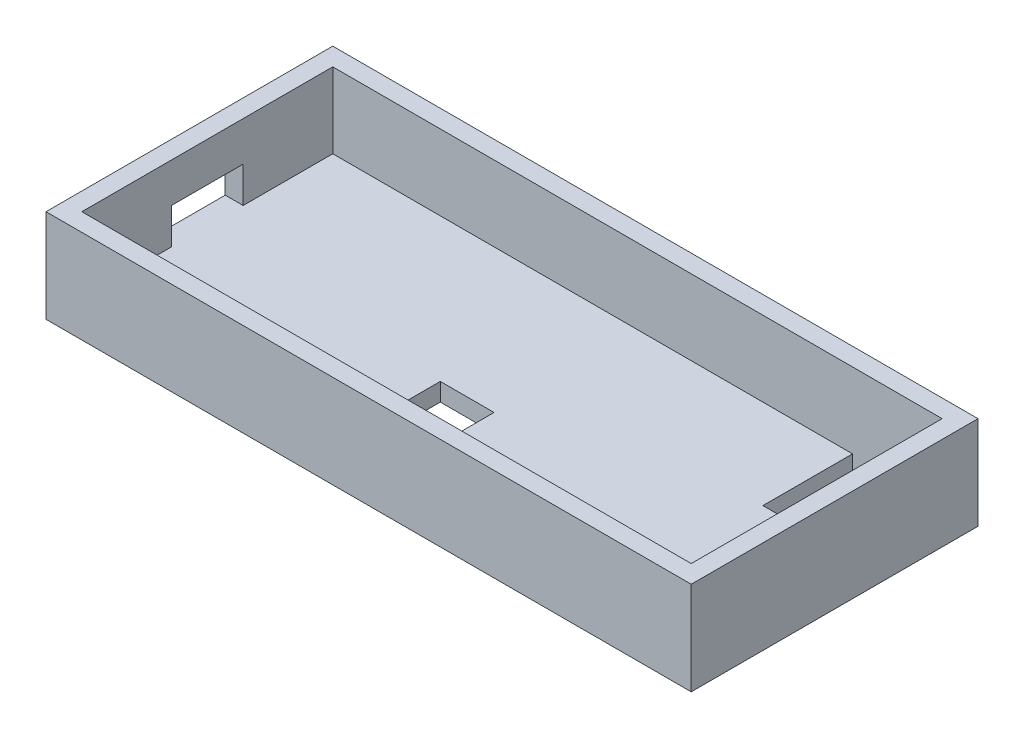
ISO-10303-21;
HEADER;
FILE_DESCRIPTION(('STEP AP214'),'2;1');
FILE_NAME('part.step','',(''),(''),'','','');
FILE_SCHEMA(('AUTOMOTIVE_DESIGN { 1 0 10303 214 1 1 1 1 }'));
ENDSEC;
DATA;
#1=APPLICATION_CONTEXT('core data for automotive mechanical design processes');
#2=APPLICATION_PROTOCOL_DEFINITION('international standard','automotive_design',2000,#1);
#3=PRODUCT_CONTEXT('',#1,'mechanical');
#4=PRODUCT('Part','Part','',(#3));
#5=PRODUCT_RELATED_PRODUCT_CATEGORY('part','',(#4));
#6=PRODUCT_DEFINITION_FORMATION('','',#4);
#7=PRODUCT_DEFINITION_CONTEXT('part definition',#1,'design');
#8=PRODUCT_DEFINITION('design','',#6,#7);
#9=PRODUCT_DEFINITION_SHAPE('','',#8);
#10=(LENGTH_UNIT() NAMED_UNIT(*) SI_UNIT(.MILLI.,.METRE.));
#11=(NAMED_UNIT(*) PLANE_ANGLE_UNIT() SI_UNIT($,.RADIAN.));
#12=(NAMED_UNIT(*) SI_UNIT($,.STERADIAN.) SOLID_ANGLE_UNIT());
#13=UNCERTAINTY_MEASURE_WITH_UNIT(LENGTH_MEASURE(1.E-05),#10,'distance_accuracy_value','');
#14=(GEOMETRIC_REPRESENTATION_CONTEXT(3) GLOBAL_UNCERTAINTY_ASSIGNED_CONTEXT((#13)) GLOBAL_UNIT_ASSIGNED_CONTEXT((#10,
#11,#12)) REPRESENTATION_CONTEXT('',''));
#15=CARTESIAN_POINT('',(0.,0.,0.));
#16=DIRECTION('',(0.,0.,1.));
#17=DIRECTION('',(1.,0.,0.));
#18=AXIS2_PLACEMENT_3D('',#15,#16,#17);
#19=CARTESIAN_POINT('',(-90.0000000000002,26.,0.));
#20=DIRECTION('',(1.,0.,0.));
#21=DIRECTION('',(0.,0.,-1.));
#22=AXIS2_PLACEMENT_3D('',#19,#20,#21);
#23=PLANE('',#22);
#24=DIRECTION('',(0.,0.,1.));
#25=VECTOR('',#24,1.);
#26=CARTESIAN_POINT('',(-90.0000000000002,0.,0.));
#27=LINE('',#26,#25);
#28=CARTESIAN_POINT('',(-90.0000000000002,0.,-40.0000000000001));
#29=VERTEX_POINT('',#28);
#30=CARTESIAN_POINT('',(-90.0000000000002,0.,39.9999999999999));
#31=VERTEX_POINT('',#30);
#32=EDGE_CURVE('E325',#29,#31,#27,.T.);
#33=ORIENTED_EDGE('',*,*,#32,.T.);
#34=DIRECTION('',(0.,-1.,0.));
#35=VECTOR('',#34,1.);
#36=CARTESIAN_POINT('',(-90.0000000000002,26.,39.9999999999999));
#37=LINE('',#36,#35);
#38=CARTESIAN_POINT('',(-90.0000000000002,26.,39.9999999999999));
#39=VERTEX_POINT('',#38);
#40=EDGE_CURVE('E350',#39,#31,#37,.T.);
#41=ORIENTED_EDGE('',*,*,#40,.F.);
#42=DIRECTION('',(0.,0.,1.));
#43=VECTOR('',#42,1.);
#44=CARTESIAN_POINT('',(-90.0000000000002,26.,0.));
#45=LINE('',#44,#43);
#46=CARTESIAN_POINT('',(-90.0000000000002,26.,-40.0000000000001));
#47=VERTEX_POINT('',#46);
#48=EDGE_CURVE('E296',#47,#39,#45,.T.);
#49=ORIENTED_EDGE('',*,*,#48,.F.);
#50=DIRECTION('',(0.,-1.,0.));
#51=VECTOR('',#50,1.);
#52=CARTESIAN_POINT('',(-90.0000000000002,26.,-40.0000000000001));
#53=LINE('',#52,#51);
#54=EDGE_CURVE('E353',#47,#29,#53,.T.);
#55=ORIENTED_EDGE('',*,*,#54,.T.);
#56=EDGE_LOOP('',(#33,#41,#49,#55));
#57=FACE_BOUND('',#56,.T.);
#58=DIRECTION('',(0.,-1.,0.));
#59=VECTOR('',#58,1.);
#60=CARTESIAN_POINT('',(-90.0000000000002,0.,10.));
#61=LINE('',#60,#59);
#62=CARTESIAN_POINT('',(-90.0000000000002,15.,10.));
#63=VERTEX_POINT('',#62);
#64=CARTESIAN_POINT('',(-90.0000000000002,5.,10.));
#65=VERTEX_POINT('',#64);
#66=EDGE_CURVE('E436',#63,#65,#61,.T.);
#67=ORIENTED_EDGE('',*,*,#66,.T.);
#68=DIRECTION('',(0.,0.,1.));
#69=VECTOR('',#68,1.);
#70=CARTESIAN_POINT('',(-90.0000000000002,5.,0.));
#71=LINE('',#70,#69);
#72=CARTESIAN_POINT('',(-90.0000000000002,5.,-9.99999999999998));
#73=VERTEX_POINT('',#72);
#74=EDGE_CURVE('E440',#73,#65,#71,.T.);
#75=ORIENTED_EDGE('',*,*,#74,.F.);
#76=DIRECTION('',(0.,-1.,0.));
#77=VECTOR('',#76,1.);
#78=CARTESIAN_POINT('',(-90.0000000000002,0.,-9.99999999999998));
#79=LINE('',#78,#77);
#80=CARTESIAN_POINT('',(-90.0000000000002,15.,-9.99999999999998));
#81=VERTEX_POINT('',#80);
#82=EDGE_CURVE('E83',#81,#73,#79,.T.);
#83=ORIENTED_EDGE('',*,*,#82,.F.);
#84=DIRECTION('',(0.,0.,1.));
#85=VECTOR('',#84,1.);
#86=CARTESIAN_POINT('',(-90.0000000000002,15.,0.));
#87=LINE('',#86,#85);
#88=EDGE_CURVE('E216',#81,#63,#87,.T.);
#89=ORIENTED_EDGE('',*,*,#88,.T.);
#90=EDGE_LOOP('',(#67,#75,#83,#89));
#91=FACE_BOUND('',#90,.T.);
#92=ADVANCED_FACE('F65',(#57,#91),#23,.F.);
#93=CARTESIAN_POINT('',(-85.0000000000002,26.,0.));
#94=DIRECTION('',(1.,0.,0.));
#95=DIRECTION('',(0.,0.,-1.));
#96=AXIS2_PLACEMENT_3D('',#93,#94,#95);
#97=PLANE('',#96);
#98=DIRECTION('',(0.,0.,1.));
#99=VECTOR('',#98,1.);
#100=CARTESIAN_POINT('',(-85.0000000000002,5.,0.));
#101=LINE('',#100,#99);
#102=CARTESIAN_POINT('',(-85.0000000000002,5.,10.));
#103=VERTEX_POINT('',#102);
#104=CARTESIAN_POINT('',(-85.0000000000002,5.,34.9999999999998));
#105=VERTEX_POINT('',#104);
#106=EDGE_CURVE('E225',#103,#105,#101,.T.);
#107=ORIENTED_EDGE('',*,*,#106,.F.);
#108=DIRECTION('',(0.,-1.,0.));
#109=VECTOR('',#108,1.);
#110=CARTESIAN_POINT('',(-85.0000000000002,0.,10.));
#111=LINE('',#110,#109);
#112=CARTESIAN_POINT('',(-85.0000000000002,15.,10.));
#113=VERTEX_POINT('',#112);
#114=EDGE_CURVE('E215',#113,#103,#111,.T.);
#115=ORIENTED_EDGE('',*,*,#114,.F.);
#116=DIRECTION('',(0.,0.,1.));
#117=VECTOR('',#116,1.);
#118=CARTESIAN_POINT('',(-85.0000000000002,15.,0.));
#119=LINE('',#118,#117);
#120=CARTESIAN_POINT('',(-85.0000000000002,15.,-9.99999999999998));
#121=VERTEX_POINT('',#120);
#122=EDGE_CURVE('E205',#121,#113,#119,.T.);
#123=ORIENTED_EDGE('',*,*,#122,.F.);
#124=DIRECTION('',(0.,-1.,0.));
#125=VECTOR('',#124,1.);
#126=CARTESIAN_POINT('',(-85.0000000000002,0.,-9.99999999999998));
#127=LINE('',#126,#125);
#128=CARTESIAN_POINT('',(-85.0000000000002,5.,-9.99999999999998));
#129=VERTEX_POINT('',#128);
#130=EDGE_CURVE('E200',#121,#129,#127,.T.);
#131=ORIENTED_EDGE('',*,*,#130,.T.);
#132=CARTESIAN_POINT('',(-85.0000000000002,5.,-35.0000000000002));
#133=VERTEX_POINT('',#132);
#134=EDGE_CURVE('E211',#133,#129,#101,.T.);
#135=ORIENTED_EDGE('',*,*,#134,.F.);
#136=DIRECTION('',(0.,-1.,0.));
#137=VECTOR('',#136,1.);
#138=CARTESIAN_POINT('',(-85.0000000000002,26.,-35.0000000000002));
#139=LINE('',#138,#137);
#140=CARTESIAN_POINT('',(-85.0000000000002,26.,-35.0000000000002));
#141=VERTEX_POINT('',#140);
#142=EDGE_CURVE('E338',#141,#133,#139,.T.);
#143=ORIENTED_EDGE('',*,*,#142,.F.);
#144=DIRECTION('',(0.,0.,1.));
#145=VECTOR('',#144,1.);
#146=CARTESIAN_POINT('',(-85.0000000000002,26.,0.));
#147=LINE('',#146,#145);
#148=CARTESIAN_POINT('',(-85.0000000000002,26.,34.9999999999998));
#149=VERTEX_POINT('',#148);
#150=EDGE_CURVE('E313',#141,#149,#147,.T.);
#151=ORIENTED_EDGE('',*,*,#150,.T.);
#152=DIRECTION('',(0.,-1.,0.));
#153=VECTOR('',#152,1.);
#154=CARTESIAN_POINT('',(-85.0000000000002,26.,34.9999999999998));
#155=LINE('',#154,#153);
#156=EDGE_CURVE('E341',#149,#105,#155,.T.);
#157=ORIENTED_EDGE('',*,*,#156,.T.);
#158=EDGE_LOOP('',(#107,#115,#123,#131,#135,#143,#151,#157));
#159=FACE_BOUND('',#158,.T.);
#160=ADVANCED_FACE('F210',(#159),#97,.T.);
#161=CARTESIAN_POINT('',(84.9999999999998,26.,0.));
#162=DIRECTION('',(1.,0.,0.));
#163=DIRECTION('',(0.,0.,-1.));
#164=AXIS2_PLACEMENT_3D('',#161,#162,#163);
#165=PLANE('',#164);
#166=DIRECTION('',(0.,-1.,0.));
#167=VECTOR('',#166,1.);
#168=CARTESIAN_POINT('',(84.9999999999998,5.,-10.0000000000002));
#169=LINE('',#168,#167);
#170=CARTESIAN_POINT('',(84.9999999999998,5.,-10.0000000000002));
#171=VERTEX_POINT('',#170);
#172=CARTESIAN_POINT('',(84.9999999999998,0.,-10.0000000000002));
#173=VERTEX_POINT('',#172);
#174=EDGE_CURVE('E272',#171,#173,#169,.T.);
#175=ORIENTED_EDGE('',*,*,#174,.F.);
#176=DIRECTION('',(0.,0.,1.));
#177=VECTOR('',#176,1.);
#178=CARTESIAN_POINT('',(84.9999999999998,5.,0.));
#179=LINE('',#178,#177);
#180=CARTESIAN_POINT('',(84.9999999999998,5.,34.9999999999999));
#181=VERTEX_POINT('',#180);
#182=EDGE_CURVE('E395',#171,#181,#179,.T.);
#183=ORIENTED_EDGE('',*,*,#182,.T.);
#184=DIRECTION('',(0.,-1.,0.));
#185=VECTOR('',#184,1.);
#186=CARTESIAN_POINT('',(84.9999999999998,26.,34.9999999999999));
#187=LINE('',#186,#185);
#188=CARTESIAN_POINT('',(84.9999999999998,26.,34.9999999999999));
#189=VERTEX_POINT('',#188);
#190=EDGE_CURVE('E75',#189,#181,#187,.T.);
#191=ORIENTED_EDGE('',*,*,#190,.F.);
#192=DIRECTION('',(0.,0.,1.));
#193=VECTOR('',#192,1.);
#194=CARTESIAN_POINT('',(84.9999999999998,26.,0.));
#195=LINE('',#194,#193);
#196=CARTESIAN_POINT('',(84.9999999999998,26.,-35.0000000000002));
#197=VERTEX_POINT('',#196);
#198=EDGE_CURVE('E306',#197,#189,#195,.T.);
#199=ORIENTED_EDGE('',*,*,#198,.F.);
#200=DIRECTION('',(0.,-1.,0.));
#201=VECTOR('',#200,1.);
#202=CARTESIAN_POINT('',(84.9999999999998,26.,-35.0000000000002));
#203=LINE('',#202,#201);
#204=CARTESIAN_POINT('',(84.9999999999998,0.,-35.0000000000002));
#205=VERTEX_POINT('',#204);
#206=EDGE_CURVE('E12',#197,#205,#203,.T.);
#207=ORIENTED_EDGE('',*,*,#206,.T.);
#208=DIRECTION('',(0.,0.,1.));
#209=VECTOR('',#208,1.);
#210=CARTESIAN_POINT('',(84.9999999999998,0.,0.));
#211=LINE('',#210,#209);
#212=EDGE_CURVE('E292',#205,#173,#211,.T.);
#213=ORIENTED_EDGE('',*,*,#212,.T.);
#214=EDGE_LOOP('',(#175,#183,#191,#199,#207,#213));
#215=FACE_BOUND('',#214,.T.);
#216=ADVANCED_FACE('F392',(#215),#165,.F.);
#217=CARTESIAN_POINT('',(0.,26.,-35.0000000000002));
#218=DIRECTION('',(0.,0.,-1.));
#219=DIRECTION('',(-1.,0.,0.));
#220=AXIS2_PLACEMENT_3D('',#217,#218,#219);
#221=PLANE('',#220);
#222=DIRECTION('',(1.,0.,0.));
#223=VECTOR('',#222,1.);
#224=CARTESIAN_POINT('',(0.,5.,-35.0000000000002));
#225=LINE('',#224,#223);
#226=CARTESIAN_POINT('',(59.9999999999998,5.,-35.0000000000002));
#227=VERTEX_POINT('',#226);
#228=EDGE_CURVE('E222',#133,#227,#225,.T.);
#229=ORIENTED_EDGE('',*,*,#228,.T.);
#230=DIRECTION('',(0.,-1.,0.));
#231=VECTOR('',#230,1.);
#232=CARTESIAN_POINT('',(59.9999999999998,5.,-35.0000000000002));
#233=LINE('',#232,#231);
#234=CARTESIAN_POINT('',(59.9999999999998,0.,-35.0000000000002));
#235=VERTEX_POINT('',#234);
#236=EDGE_CURVE('E264',#227,#235,#233,.T.);
#237=ORIENTED_EDGE('',*,*,#236,.T.);
#238=DIRECTION('',(1.,0.,0.));
#239=VECTOR('',#238,1.);
#240=CARTESIAN_POINT('',(0.,0.,-35.0000000000002));
#241=LINE('',#240,#239);
#242=EDGE_CURVE('E332',#235,#205,#241,.T.);
#243=ORIENTED_EDGE('',*,*,#242,.T.);
#244=ORIENTED_EDGE('',*,*,#206,.F.);
#245=DIRECTION('',(1.,0.,0.));
#246=VECTOR('',#245,1.);
#247=CARTESIAN_POINT('',(0.,26.,-35.0000000000002));
#248=LINE('',#247,#246);
#249=EDGE_CURVE('E302',#141,#197,#248,.T.);
#250=ORIENTED_EDGE('',*,*,#249,.F.);
#251=ORIENTED_EDGE('',*,*,#142,.T.);
#252=EDGE_LOOP('',(#229,#237,#243,#244,#250,#251));
#253=FACE_BOUND('',#252,.T.);
#254=ADVANCED_FACE('F387',(#253),#221,.F.);
#255=CARTESIAN_POINT('',(0.,26.,34.9999999999999));
#256=DIRECTION('',(0.,0.,-1.));
#257=DIRECTION('',(-1.,0.,0.));
#258=AXIS2_PLACEMENT_3D('',#255,#256,#257);
#259=PLANE('',#258);
#260=DIRECTION('',(1.,0.,0.));
#261=VECTOR('',#260,1.);
#262=CARTESIAN_POINT('',(0.,5.,34.9999999999999));
#263=LINE('',#262,#261);
#264=EDGE_CURVE('E410',#105,#181,#263,.T.);
#265=ORIENTED_EDGE('',*,*,#264,.F.);
#266=ORIENTED_EDGE('',*,*,#156,.F.);
#267=DIRECTION('',(1.,0.,0.));
#268=VECTOR('',#267,1.);
#269=CARTESIAN_POINT('',(0.,26.,34.9999999999999));
#270=LINE('',#269,#268);
#271=EDGE_CURVE('E309',#149,#189,#270,.T.);
#272=ORIENTED_EDGE('',*,*,#271,.T.);
#273=ORIENTED_EDGE('',*,*,#190,.T.);
#274=EDGE_LOOP('',(#265,#266,#272,#273));
#275=FACE_BOUND('',#274,.T.);
#276=ADVANCED_FACE('F398',(#275),#259,.T.);
#277=CARTESIAN_POINT('',(89.9999999999998,26.,0.));
#278=DIRECTION('',(1.,0.,0.));
#279=DIRECTION('',(0.,0.,-1.));
#280=AXIS2_PLACEMENT_3D('',#277,#278,#279);
#281=PLANE('',#280);
#282=DIRECTION('',(0.,0.,1.));
#283=VECTOR('',#282,1.);
#284=CARTESIAN_POINT('',(89.9999999999998,0.,0.));
#285=LINE('',#284,#283);
#286=CARTESIAN_POINT('',(89.9999999999998,0.,-40.0000000000001));
#287=VERTEX_POINT('',#286);
#288=CARTESIAN_POINT('',(89.9999999999998,0.,39.9999999999999));
#289=VERTEX_POINT('',#288);
#290=EDGE_CURVE('E275',#287,#289,#285,.T.);
#291=ORIENTED_EDGE('',*,*,#290,.F.);
#292=DIRECTION('',(0.,-1.,0.));
#293=VECTOR('',#292,1.);
#294=CARTESIAN_POINT('',(89.9999999999998,26.,-40.0000000000001));
#295=LINE('',#294,#293);
#296=CARTESIAN_POINT('',(89.9999999999998,26.,-40.0000000000001));
#297=VERTEX_POINT('',#296);
#298=EDGE_CURVE('E69',#297,#287,#295,.T.);
#299=ORIENTED_EDGE('',*,*,#298,.F.);
#300=DIRECTION('',(0.,0.,1.));
#301=VECTOR('',#300,1.);
#302=CARTESIAN_POINT('',(89.9999999999998,26.,0.));
#303=LINE('',#302,#301);
#304=CARTESIAN_POINT('',(89.9999999999998,26.,39.9999999999999));
#305=VERTEX_POINT('',#304);
#306=EDGE_CURVE('E287',#297,#305,#303,.T.);
#307=ORIENTED_EDGE('',*,*,#306,.T.);
#308=DIRECTION('',(0.,-1.,0.));
#309=VECTOR('',#308,1.);
#310=CARTESIAN_POINT('',(89.9999999999998,26.,39.9999999999999));
#311=LINE('',#310,#309);
#312=EDGE_CURVE('E317',#305,#289,#311,.T.);
#313=ORIENTED_EDGE('',*,*,#312,.T.);
#314=EDGE_LOOP('',(#291,#299,#307,#313));
#315=FACE_BOUND('',#314,.T.);
#316=ADVANCED_FACE('F67',(#315),#281,.T.);
#317=CARTESIAN_POINT('',(0.,26.,-40.0000000000001));
#318=DIRECTION('',(0.,0.,-1.));
#319=DIRECTION('',(-1.,0.,0.));
#320=AXIS2_PLACEMENT_3D('',#317,#318,#319);
#321=PLANE('',#320);
#322=DIRECTION('',(1.,0.,0.));
#323=VECTOR('',#322,1.);
#324=CARTESIAN_POINT('',(0.,0.,-40.0000000000001));
#325=LINE('',#324,#323);
#326=EDGE_CURVE('E321',#29,#287,#325,.T.);
#327=ORIENTED_EDGE('',*,*,#326,.F.);
#328=ORIENTED_EDGE('',*,*,#54,.F.);
#329=DIRECTION('',(1.,0.,0.));
#330=VECTOR('',#329,1.);
#331=CARTESIAN_POINT('',(0.,26.,-40.0000000000001));
#332=LINE('',#331,#330);
#333=EDGE_CURVE('E291',#47,#297,#332,.T.);
#334=ORIENTED_EDGE('',*,*,#333,.T.);
#335=ORIENTED_EDGE('',*,*,#298,.T.);
#336=EDGE_LOOP('',(#327,#328,#334,#335));
#337=FACE_BOUND('',#336,.T.);
#338=ADVANCED_FACE('F362',(#337),#321,.T.);
#339=CARTESIAN_POINT('',(0.,26.,39.9999999999999));
#340=DIRECTION('',(0.,0.,-1.));
#341=DIRECTION('',(-1.,0.,0.));
#342=AXIS2_PLACEMENT_3D('',#339,#340,#341);
#343=PLANE('',#342);
#344=DIRECTION('',(1.,0.,0.));
#345=VECTOR('',#344,1.);
#346=CARTESIAN_POINT('',(0.,0.,39.9999999999999));
#347=LINE('',#346,#345);
#348=EDGE_CURVE('E328',#31,#289,#347,.T.);
#349=ORIENTED_EDGE('',*,*,#348,.T.);
#350=ORIENTED_EDGE('',*,*,#312,.F.);
#351=DIRECTION('',(1.,0.,0.));
#352=VECTOR('',#351,1.);
#353=CARTESIAN_POINT('',(0.,26.,39.9999999999999));
#354=LINE('',#353,#352);
#355=EDGE_CURVE('E299',#39,#305,#354,.T.);
#356=ORIENTED_EDGE('',*,*,#355,.F.);
#357=ORIENTED_EDGE('',*,*,#40,.T.);
#358=EDGE_LOOP('',(#349,#350,#356,#357));
#359=FACE_BOUND('',#358,.T.);
#360=ADVANCED_FACE('F375',(#359),#343,.F.);
#361=CARTESIAN_POINT('',(0.,26.,0.));
#362=DIRECTION('',(0.,1.,0.));
#363=DIRECTION('',(0.,0.,1.));
#364=AXIS2_PLACEMENT_3D('',#361,#362,#363);
#365=PLANE('',#364);
#366=ORIENTED_EDGE('',*,*,#306,.F.);
#367=ORIENTED_EDGE('',*,*,#333,.F.);
#368=ORIENTED_EDGE('',*,*,#48,.T.);
#369=ORIENTED_EDGE('',*,*,#355,.T.);
#370=EDGE_LOOP('',(#366,#367,#368,#369));
#371=FACE_BOUND('',#370,.T.);
#372=ORIENTED_EDGE('',*,*,#249,.T.);
#373=ORIENTED_EDGE('',*,*,#198,.T.);
#374=ORIENTED_EDGE('',*,*,#271,.F.);
#375=ORIENTED_EDGE('',*,*,#150,.F.);
#376=EDGE_LOOP('',(#372,#373,#374,#375));
#377=FACE_BOUND('',#376,.T.);
#378=ADVANCED_FACE('F377',(#371,#377),#365,.T.);
#379=CARTESIAN_POINT('',(0.,0.,0.));
#380=DIRECTION('',(0.,1.,0.));
#381=DIRECTION('',(0.,0.,1.));
#382=AXIS2_PLACEMENT_3D('',#379,#380,#381);
#383=PLANE('',#382);
#384=ORIENTED_EDGE('',*,*,#242,.F.);
#385=DIRECTION('',(0.,0.,1.));
#386=VECTOR('',#385,1.);
#387=CARTESIAN_POINT('',(59.9999999999998,0.,0.));
#388=LINE('',#387,#386);
#389=CARTESIAN_POINT('',(59.9999999999998,0.,-10.0000000000002));
#390=VERTEX_POINT('',#389);
#391=EDGE_CURVE('E255',#235,#390,#388,.T.);
#392=ORIENTED_EDGE('',*,*,#391,.T.);
#393=DIRECTION('',(-1.,0.,0.));
#394=VECTOR('',#393,1.);
#395=CARTESIAN_POINT('',(0.,0.,-10.0000000000001));
#396=LINE('',#395,#394);
#397=EDGE_CURVE('E251',#173,#390,#396,.T.);
#398=ORIENTED_EDGE('',*,*,#397,.F.);
#399=ORIENTED_EDGE('',*,*,#212,.F.);
#400=EDGE_LOOP('',(#384,#392,#398,#399));
#401=FACE_BOUND('',#400,.T.);
#402=ORIENTED_EDGE('',*,*,#290,.T.);
#403=ORIENTED_EDGE('',*,*,#348,.F.);
#404=ORIENTED_EDGE('',*,*,#32,.F.);
#405=ORIENTED_EDGE('',*,*,#326,.T.);
#406=EDGE_LOOP('',(#402,#403,#404,#405));
#407=FACE_BOUND('',#406,.T.);
#408=DIRECTION('',(1.,0.,0.));
#409=VECTOR('',#408,1.);
#410=CARTESIAN_POINT('',(0.,0.,14.9999999999998));
#411=LINE('',#410,#409);
#412=CARTESIAN_POINT('',(-15.0000000000002,0.,14.9999999999998));
#413=VERTEX_POINT('',#412);
#414=CARTESIAN_POINT('',(0.,0.,14.9999999999998));
#415=VERTEX_POINT('',#414);
#416=EDGE_CURVE('E235',#413,#415,#411,.T.);
#417=ORIENTED_EDGE('',*,*,#416,.T.);
#418=DIRECTION('',(0.,0.,-1.));
#419=VECTOR('',#418,1.);
#420=CARTESIAN_POINT('',(0.,0.,0.));
#421=LINE('',#420,#419);
#422=CARTESIAN_POINT('',(0.,0.,4.99999999999984));
#423=VERTEX_POINT('',#422);
#424=EDGE_CURVE('E247',#415,#423,#421,.T.);
#425=ORIENTED_EDGE('',*,*,#424,.T.);
#426=DIRECTION('',(1.,0.,0.));
#427=VECTOR('',#426,1.);
#428=CARTESIAN_POINT('',(0.,0.,4.99999999999984));
#429=LINE('',#428,#427);
#430=CARTESIAN_POINT('',(-15.0000000000002,0.,4.99999999999984));
#431=VERTEX_POINT('',#430);
#432=EDGE_CURVE('E243',#431,#423,#429,.T.);
#433=ORIENTED_EDGE('',*,*,#432,.F.);
#434=DIRECTION('',(0.,0.,-1.));
#435=VECTOR('',#434,1.);
#436=CARTESIAN_POINT('',(-15.0000000000002,0.,0.));
#437=LINE('',#436,#435);
#438=EDGE_CURVE('E239',#413,#431,#437,.T.);
#439=ORIENTED_EDGE('',*,*,#438,.F.);
#440=EDGE_LOOP('',(#417,#425,#433,#439));
#441=FACE_BOUND('',#440,.T.);
#442=CARTESIAN_POINT('',(75.9260693328372,0.,27.8286623683641));
#443=DIRECTION('',(0.,1.,0.));
#444=DIRECTION('',(0.,0.,1.));
#445=AXIS2_PLACEMENT_3D('',#442,#443,#444);
#446=CIRCLE('',#445,5.);
#447=CARTESIAN_POINT('',(75.9260693328372,0.,32.8286623683641));
#448=VERTEX_POINT('',#447);
#449=EDGE_CURVE('E259',#448,#448,#446,.T.);
#450=ORIENTED_EDGE('',*,*,#449,.T.);
#451=EDGE_LOOP('',(#450));
#452=FACE_BOUND('',#451,.T.);
#453=ADVANCED_FACE('F369',(#401,#407,#441,#452),#383,.F.);
#454=CARTESIAN_POINT('',(0.,5.,-10.0000000000001));
#455=DIRECTION('',(0.,0.,1.));
#456=DIRECTION('',(1.,0.,0.));
#457=AXIS2_PLACEMENT_3D('',#454,#455,#456);
#458=PLANE('',#457);
#459=ORIENTED_EDGE('',*,*,#397,.T.);
#460=DIRECTION('',(0.,-1.,0.));
#461=VECTOR('',#460,1.);
#462=CARTESIAN_POINT('',(59.9999999999998,5.,-10.0000000000002));
#463=LINE('',#462,#461);
#464=CARTESIAN_POINT('',(59.9999999999998,5.,-10.0000000000002));
#465=VERTEX_POINT('',#464);
#466=EDGE_CURVE('E268',#465,#390,#463,.T.);
#467=ORIENTED_EDGE('',*,*,#466,.F.);
#468=DIRECTION('',(-1.,0.,0.));
#469=VECTOR('',#468,1.);
#470=CARTESIAN_POINT('',(0.,5.,-10.0000000000001));
#471=LINE('',#470,#469);
#472=EDGE_CURVE('E403',#171,#465,#471,.T.);
#473=ORIENTED_EDGE('',*,*,#472,.F.);
#474=ORIENTED_EDGE('',*,*,#174,.T.);
#475=EDGE_LOOP('',(#459,#467,#473,#474));
#476=FACE_BOUND('',#475,.T.);
#477=ADVANCED_FACE('F455',(#476),#458,.F.);
#478=CARTESIAN_POINT('',(59.9999999999998,5.,0.));
#479=DIRECTION('',(1.,0.,0.));
#480=DIRECTION('',(0.,0.,-1.));
#481=AXIS2_PLACEMENT_3D('',#478,#479,#480);
#482=PLANE('',#481);
#483=ORIENTED_EDGE('',*,*,#391,.F.);
#484=ORIENTED_EDGE('',*,*,#236,.F.);
#485=DIRECTION('',(0.,0.,1.));
#486=VECTOR('',#485,1.);
#487=CARTESIAN_POINT('',(59.9999999999998,5.,0.));
#488=LINE('',#487,#486);
#489=EDGE_CURVE('E400',#227,#465,#488,.T.);
#490=ORIENTED_EDGE('',*,*,#489,.T.);
#491=ORIENTED_EDGE('',*,*,#466,.T.);
#492=EDGE_LOOP('',(#483,#484,#490,#491));
#493=FACE_BOUND('',#492,.T.);
#494=ADVANCED_FACE('F457',(#493),#482,.T.);
#495=CARTESIAN_POINT('',(0.,5.,14.9999999999998));
#496=DIRECTION('',(0.,0.,-1.));
#497=DIRECTION('',(-1.,0.,0.));
#498=AXIS2_PLACEMENT_3D('',#495,#496,#497);
#499=PLANE('',#498);
#500=ORIENTED_EDGE('',*,*,#416,.F.);
#501=DIRECTION('',(0.,-1.,0.));
#502=VECTOR('',#501,1.);
#503=CARTESIAN_POINT('',(-15.0000000000002,5.,14.9999999999998));
#504=LINE('',#503,#502);
#505=CARTESIAN_POINT('',(-15.0000000000002,5.,14.9999999999998));
#506=VERTEX_POINT('',#505);
#507=EDGE_CURVE('E269',#506,#413,#504,.T.);
#508=ORIENTED_EDGE('',*,*,#507,.F.);
#509=DIRECTION('',(1.,0.,0.));
#510=VECTOR('',#509,1.);
#511=CARTESIAN_POINT('',(0.,5.,14.9999999999998));
#512=LINE('',#511,#510);
#513=CARTESIAN_POINT('',(0.,5.,14.9999999999998));
#514=VERTEX_POINT('',#513);
#515=EDGE_CURVE('E263',#506,#514,#512,.T.);
#516=ORIENTED_EDGE('',*,*,#515,.T.);
#517=DIRECTION('',(0.,-1.,0.));
#518=VECTOR('',#517,1.);
#519=CARTESIAN_POINT('',(0.,5.,14.9999999999998));
#520=LINE('',#519,#518);
#521=EDGE_CURVE('E230',#514,#415,#520,.T.);
#522=ORIENTED_EDGE('',*,*,#521,.T.);
#523=EDGE_LOOP('',(#500,#508,#516,#522));
#524=FACE_BOUND('',#523,.T.);
#525=ADVANCED_FACE('F459',(#524),#499,.T.);
#526=CARTESIAN_POINT('',(-15.0000000000002,5.,0.));
#527=DIRECTION('',(-1.,0.,0.));
#528=DIRECTION('',(0.,0.,1.));
#529=AXIS2_PLACEMENT_3D('',#526,#527,#528);
#530=PLANE('',#529);
#531=ORIENTED_EDGE('',*,*,#438,.T.);
#532=DIRECTION('',(0.,-1.,0.));
#533=VECTOR('',#532,1.);
#534=CARTESIAN_POINT('',(-15.0000000000002,5.,4.99999999999984));
#535=LINE('',#534,#533);
#536=CARTESIAN_POINT('',(-15.0000000000002,5.,4.99999999999984));
#537=VERTEX_POINT('',#536);
#538=EDGE_CURVE('E281',#537,#431,#535,.T.);
#539=ORIENTED_EDGE('',*,*,#538,.F.);
#540=DIRECTION('',(0.,0.,-1.));
#541=VECTOR('',#540,1.);
#542=CARTESIAN_POINT('',(-15.0000000000002,5.,0.));
#543=LINE('',#542,#541);
#544=EDGE_CURVE('E420',#506,#537,#543,.T.);
#545=ORIENTED_EDGE('',*,*,#544,.F.);
#546=ORIENTED_EDGE('',*,*,#507,.T.);
#547=EDGE_LOOP('',(#531,#539,#545,#546));
#548=FACE_BOUND('',#547,.T.);
#549=ADVANCED_FACE('F465',(#548),#530,.F.);
#550=CARTESIAN_POINT('',(0.,5.,4.99999999999984));
#551=DIRECTION('',(0.,0.,-1.));
#552=DIRECTION('',(-1.,0.,0.));
#553=AXIS2_PLACEMENT_3D('',#550,#551,#552);
#554=PLANE('',#553);
#555=ORIENTED_EDGE('',*,*,#432,.T.);
#556=DIRECTION('',(0.,-1.,0.));
#557=VECTOR('',#556,1.);
#558=CARTESIAN_POINT('',(0.,5.,4.99999999999984));
#559=LINE('',#558,#557);
#560=CARTESIAN_POINT('',(0.,5.,4.99999999999984));
#561=VERTEX_POINT('',#560);
#562=EDGE_CURVE('E278',#561,#423,#559,.T.);
#563=ORIENTED_EDGE('',*,*,#562,.F.);
#564=DIRECTION('',(1.,0.,0.));
#565=VECTOR('',#564,1.);
#566=CARTESIAN_POINT('',(0.,5.,4.99999999999984));
#567=LINE('',#566,#565);
#568=EDGE_CURVE('E417',#537,#561,#567,.T.);
#569=ORIENTED_EDGE('',*,*,#568,.F.);
#570=ORIENTED_EDGE('',*,*,#538,.T.);
#571=EDGE_LOOP('',(#555,#563,#569,#570));
#572=FACE_BOUND('',#571,.T.);
#573=ADVANCED_FACE('F542',(#572),#554,.F.);
#574=CARTESIAN_POINT('',(0.,5.,0.));
#575=DIRECTION('',(-1.,0.,0.));
#576=DIRECTION('',(0.,0.,1.));
#577=AXIS2_PLACEMENT_3D('',#574,#575,#576);
#578=PLANE('',#577);
#579=ORIENTED_EDGE('',*,*,#424,.F.);
#580=ORIENTED_EDGE('',*,*,#521,.F.);
#581=DIRECTION('',(0.,0.,-1.));
#582=VECTOR('',#581,1.);
#583=CARTESIAN_POINT('',(0.,5.,0.));
#584=LINE('',#583,#582);
#585=EDGE_CURVE('E413',#514,#561,#584,.T.);
#586=ORIENTED_EDGE('',*,*,#585,.T.);
#587=ORIENTED_EDGE('',*,*,#562,.T.);
#588=EDGE_LOOP('',(#579,#580,#586,#587));
#589=FACE_BOUND('',#588,.T.);
#590=ADVANCED_FACE('F552',(#589),#578,.T.);
#591=CARTESIAN_POINT('',(75.9260693328372,5.,27.8286623683641));
#592=DIRECTION('',(0.,-1.,0.));
#593=DIRECTION('',(0.,0.,-1.));
#594=AXIS2_PLACEMENT_3D('',#591,#592,#593);
#595=CYLINDRICAL_SURFACE('',#594,5.);
#596=CARTESIAN_POINT('',(75.9260693328372,5.,27.8286623683641));
#597=DIRECTION('',(0.,1.,0.));
#598=DIRECTION('',(0.,0.,1.));
#599=AXIS2_PLACEMENT_3D('',#596,#597,#598);
#600=CIRCLE('',#599,5.);
#601=CARTESIAN_POINT('',(75.9260693328372,5.,32.8286623683641));
#602=VERTEX_POINT('',#601);
#603=EDGE_CURVE('E224',#602,#602,#600,.T.);
#604=ORIENTED_EDGE('',*,*,#603,.T.);
#605=EDGE_LOOP('',(#604));
#606=FACE_BOUND('',#605,.T.);
#607=ORIENTED_EDGE('',*,*,#449,.F.);
#608=EDGE_LOOP('',(#607));
#609=FACE_BOUND('',#608,.T.);
#610=ADVANCED_FACE('F562',(#606,#609),#595,.F.);
#611=CARTESIAN_POINT('',(0.,5.,0.));
#612=DIRECTION('',(0.,1.,0.));
#613=DIRECTION('',(0.,0.,1.));
#614=AXIS2_PLACEMENT_3D('',#611,#612,#613);
#615=PLANE('',#614);
#616=ORIENTED_EDGE('',*,*,#515,.F.);
#617=ORIENTED_EDGE('',*,*,#544,.T.);
#618=ORIENTED_EDGE('',*,*,#568,.T.);
#619=ORIENTED_EDGE('',*,*,#585,.F.);
#620=EDGE_LOOP('',(#616,#617,#618,#619));
#621=FACE_BOUND('',#620,.T.);
#622=ORIENTED_EDGE('',*,*,#264,.T.);
#623=ORIENTED_EDGE('',*,*,#182,.F.);
#624=ORIENTED_EDGE('',*,*,#472,.T.);
#625=ORIENTED_EDGE('',*,*,#489,.F.);
#626=ORIENTED_EDGE('',*,*,#228,.F.);
#627=ORIENTED_EDGE('',*,*,#134,.T.);
#628=DIRECTION('',(-1.,0.,0.));
#629=VECTOR('',#628,1.);
#630=CARTESIAN_POINT('',(-85.0000000000002,5.,-9.99999999999998));
#631=LINE('',#630,#629);
#632=EDGE_CURVE('E197',#129,#73,#631,.T.);
#633=ORIENTED_EDGE('',*,*,#632,.T.);
#634=ORIENTED_EDGE('',*,*,#74,.T.);
#635=DIRECTION('',(-1.,0.,0.));
#636=VECTOR('',#635,1.);
#637=CARTESIAN_POINT('',(-85.0000000000002,5.,10.));
#638=LINE('',#637,#636);
#639=EDGE_CURVE('E91',#103,#65,#638,.T.);
#640=ORIENTED_EDGE('',*,*,#639,.F.);
#641=ORIENTED_EDGE('',*,*,#106,.T.);
#642=EDGE_LOOP('',(#622,#623,#624,#625,#626,#627,#633,#634,#640,#641));
#643=FACE_BOUND('',#642,.T.);
#644=ORIENTED_EDGE('',*,*,#603,.F.);
#645=EDGE_LOOP('',(#644));
#646=FACE_BOUND('',#645,.T.);
#647=ADVANCED_FACE('F218',(#621,#643,#646),#615,.T.);
#648=CARTESIAN_POINT('',(-85.0000000000002,0.,10.));
#649=DIRECTION('',(0.,0.,-1.));
#650=DIRECTION('',(-1.,0.,0.));
#651=AXIS2_PLACEMENT_3D('',#648,#649,#650);
#652=PLANE('',#651);
#653=ORIENTED_EDGE('',*,*,#66,.F.);
#654=DIRECTION('',(-1.,0.,0.));
#655=VECTOR('',#654,1.);
#656=CARTESIAN_POINT('',(-85.0000000000002,15.,10.));
#657=LINE('',#656,#655);
#658=EDGE_CURVE('E428',#113,#63,#657,.T.);
#659=ORIENTED_EDGE('',*,*,#658,.F.);
#660=ORIENTED_EDGE('',*,*,#114,.T.);
#661=ORIENTED_EDGE('',*,*,#639,.T.);
#662=EDGE_LOOP('',(#653,#659,#660,#661));
#663=FACE_BOUND('',#662,.T.);
#664=ADVANCED_FACE('F451',(#663),#652,.T.);
#665=CARTESIAN_POINT('',(-85.0000000000002,15.,0.));
#666=DIRECTION('',(0.,-1.,0.));
#667=DIRECTION('',(0.,0.,-1.));
#668=AXIS2_PLACEMENT_3D('',#665,#666,#667);
#669=PLANE('',#668);
#670=ORIENTED_EDGE('',*,*,#88,.F.);
#671=DIRECTION('',(-1.,0.,0.));
#672=VECTOR('',#671,1.);
#673=CARTESIAN_POINT('',(-85.0000000000002,15.,-9.99999999999998));
#674=LINE('',#673,#672);
#675=EDGE_CURVE('E240',#121,#81,#674,.T.);
#676=ORIENTED_EDGE('',*,*,#675,.F.);
#677=ORIENTED_EDGE('',*,*,#122,.T.);
#678=ORIENTED_EDGE('',*,*,#658,.T.);
#679=EDGE_LOOP('',(#670,#676,#677,#678));
#680=FACE_BOUND('',#679,.T.);
#681=ADVANCED_FACE('F601',(#680),#669,.T.);
#682=CARTESIAN_POINT('',(-85.0000000000002,0.,-9.99999999999998));
#683=DIRECTION('',(0.,0.,-1.));
#684=DIRECTION('',(0.,1.,0.));
#685=AXIS2_PLACEMENT_3D('',#682,#683,#684);
#686=PLANE('',#685);
#687=ORIENTED_EDGE('',*,*,#82,.T.);
#688=ORIENTED_EDGE('',*,*,#632,.F.);
#689=ORIENTED_EDGE('',*,*,#130,.F.);
#690=ORIENTED_EDGE('',*,*,#675,.T.);
#691=EDGE_LOOP('',(#687,#688,#689,#690));
#692=FACE_BOUND('',#691,.T.);
#693=ADVANCED_FACE('F199',(#692),#686,.F.);
#694=CLOSED_SHELL('',(#92,#160,#216,#254,#276,#316,#338,#360,#378,#453,#477,#494,#525,#549,#573,
#590,#610,#647,#664,#681,#693));
#695=MANIFOLD_SOLID_BREP('B2',#694);
#696=ADVANCED_BREP_SHAPE_REPRESENTATION('',(#18,#695),#14);
#697=SHAPE_DEFINITION_REPRESENTATION(#9,#696);
ENDSEC;
END-ISO-10303-21;
